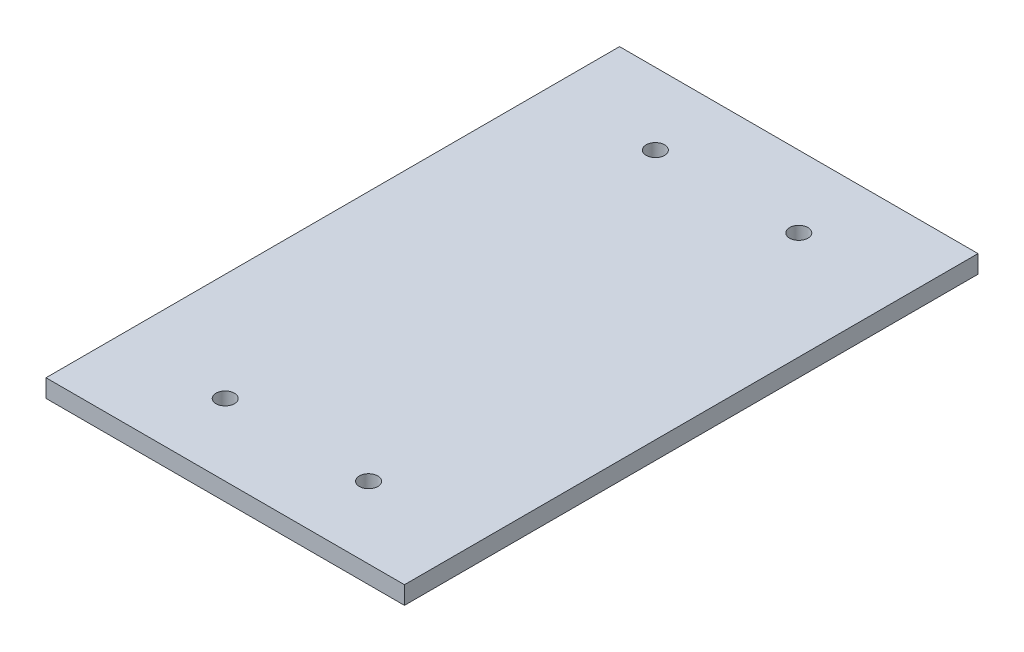
ISO-10303-21;
HEADER;
FILE_DESCRIPTION(('STEP AP214'),'2;1');
FILE_NAME('part.step','',(''),(''),'','','');
FILE_SCHEMA(('AUTOMOTIVE_DESIGN { 1 0 10303 214 1 1 1 1 }'));
ENDSEC;
DATA;
#1=APPLICATION_CONTEXT('core data for automotive mechanical design processes');
#2=APPLICATION_PROTOCOL_DEFINITION('international standard','automotive_design',2000,#1);
#3=PRODUCT_CONTEXT('',#1,'mechanical');
#4=PRODUCT('Part','Part','',(#3));
#5=PRODUCT_RELATED_PRODUCT_CATEGORY('part','',(#4));
#6=PRODUCT_DEFINITION_FORMATION('','',#4);
#7=PRODUCT_DEFINITION_CONTEXT('part definition',#1,'design');
#8=PRODUCT_DEFINITION('design','',#6,#7);
#9=PRODUCT_DEFINITION_SHAPE('','',#8);
#10=(LENGTH_UNIT() NAMED_UNIT(*) SI_UNIT(.MILLI.,.METRE.));
#11=(NAMED_UNIT(*) PLANE_ANGLE_UNIT() SI_UNIT($,.RADIAN.));
#12=(NAMED_UNIT(*) SI_UNIT($,.STERADIAN.) SOLID_ANGLE_UNIT());
#13=UNCERTAINTY_MEASURE_WITH_UNIT(LENGTH_MEASURE(1.E-05),#10,'distance_accuracy_value','');
#14=(GEOMETRIC_REPRESENTATION_CONTEXT(3) GLOBAL_UNCERTAINTY_ASSIGNED_CONTEXT((#13)) GLOBAL_UNIT_ASSIGNED_CONTEXT((#10,
#11,#12)) REPRESENTATION_CONTEXT('',''));
#15=CARTESIAN_POINT('',(0.,0.,0.));
#16=DIRECTION('',(0.,0.,1.));
#17=DIRECTION('',(1.,0.,0.));
#18=AXIS2_PLACEMENT_3D('',#15,#16,#17);
#19=CARTESIAN_POINT('',(63.5,6.35,-101.6));
#20=DIRECTION('',(-1.,0.,0.));
#21=DIRECTION('',(0.,0.,1.));
#22=AXIS2_PLACEMENT_3D('',#19,#20,#21);
#23=PLANE('',#22);
#24=DIRECTION('',(0.,0.,-1.));
#25=VECTOR('',#24,1.);
#26=CARTESIAN_POINT('',(63.5,0.,-101.6));
#27=LINE('',#26,#25);
#28=CARTESIAN_POINT('',(63.5,0.,101.6));
#29=VERTEX_POINT('',#28);
#30=CARTESIAN_POINT('',(63.5,0.,-101.6));
#31=VERTEX_POINT('',#30);
#32=EDGE_CURVE('E97',#29,#31,#27,.T.);
#33=ORIENTED_EDGE('',*,*,#32,.T.);
#34=DIRECTION('',(0.,-1.,0.));
#35=VECTOR('',#34,1.);
#36=CARTESIAN_POINT('',(63.5,6.35,-101.6));
#37=LINE('',#36,#35);
#38=CARTESIAN_POINT('',(63.5,6.35,-101.6));
#39=VERTEX_POINT('',#38);
#40=EDGE_CURVE('E11',#39,#31,#37,.T.);
#41=ORIENTED_EDGE('',*,*,#40,.F.);
#42=DIRECTION('',(0.,0.,-1.));
#43=VECTOR('',#42,1.);
#44=CARTESIAN_POINT('',(63.5,6.35,-101.6));
#45=LINE('',#44,#43);
#46=CARTESIAN_POINT('',(63.5,6.35,101.6));
#47=VERTEX_POINT('',#46);
#48=EDGE_CURVE('E85',#47,#39,#45,.T.);
#49=ORIENTED_EDGE('',*,*,#48,.F.);
#50=DIRECTION('',(0.,-1.,0.));
#51=VECTOR('',#50,1.);
#52=CARTESIAN_POINT('',(63.5,6.35,101.6));
#53=LINE('',#52,#51);
#54=EDGE_CURVE('E93',#47,#29,#53,.T.);
#55=ORIENTED_EDGE('',*,*,#54,.T.);
#56=EDGE_LOOP('',(#33,#41,#49,#55));
#57=FACE_BOUND('',#56,.T.);
#58=ADVANCED_FACE('F34',(#57),#23,.F.);
#59=CARTESIAN_POINT('',(-63.5,6.35,-101.6));
#60=DIRECTION('',(0.,0.,1.));
#61=DIRECTION('',(1.,0.,0.));
#62=AXIS2_PLACEMENT_3D('',#59,#60,#61);
#63=PLANE('',#62);
#64=DIRECTION('',(-1.,0.,0.));
#65=VECTOR('',#64,1.);
#66=CARTESIAN_POINT('',(-63.5,0.,-101.6));
#67=LINE('',#66,#65);
#68=CARTESIAN_POINT('',(-63.5,0.,-101.6));
#69=VERTEX_POINT('',#68);
#70=EDGE_CURVE('E89',#31,#69,#67,.T.);
#71=ORIENTED_EDGE('',*,*,#70,.T.);
#72=DIRECTION('',(0.,-1.,0.));
#73=VECTOR('',#72,1.);
#74=CARTESIAN_POINT('',(-63.5,6.35,-101.6));
#75=LINE('',#74,#73);
#76=CARTESIAN_POINT('',(-63.5,6.35,-101.6));
#77=VERTEX_POINT('',#76);
#78=EDGE_CURVE('E42',#77,#69,#75,.T.);
#79=ORIENTED_EDGE('',*,*,#78,.F.);
#80=DIRECTION('',(-1.,0.,0.));
#81=VECTOR('',#80,1.);
#82=CARTESIAN_POINT('',(-63.5,6.35,-101.6));
#83=LINE('',#82,#81);
#84=EDGE_CURVE('E80',#39,#77,#83,.T.);
#85=ORIENTED_EDGE('',*,*,#84,.F.);
#86=ORIENTED_EDGE('',*,*,#40,.T.);
#87=EDGE_LOOP('',(#71,#79,#85,#86));
#88=FACE_BOUND('',#87,.T.);
#89=ADVANCED_FACE('F88',(#88),#63,.F.);
#90=CARTESIAN_POINT('',(-63.5,6.35,-101.6));
#91=DIRECTION('',(1.,0.,0.));
#92=DIRECTION('',(0.,0.,-1.));
#93=AXIS2_PLACEMENT_3D('',#90,#91,#92);
#94=PLANE('',#93);
#95=DIRECTION('',(0.,0.,1.));
#96=VECTOR('',#95,1.);
#97=CARTESIAN_POINT('',(-63.5,0.,-101.6));
#98=LINE('',#97,#96);
#99=CARTESIAN_POINT('',(-63.5,0.,101.6));
#100=VERTEX_POINT('',#99);
#101=EDGE_CURVE('E67',#69,#100,#98,.T.);
#102=ORIENTED_EDGE('',*,*,#101,.T.);
#103=DIRECTION('',(0.,-1.,0.));
#104=VECTOR('',#103,1.);
#105=CARTESIAN_POINT('',(-63.5,6.35,101.6));
#106=LINE('',#105,#104);
#107=CARTESIAN_POINT('',(-63.5,6.35,101.6));
#108=VERTEX_POINT('',#107);
#109=EDGE_CURVE('E90',#108,#100,#106,.T.);
#110=ORIENTED_EDGE('',*,*,#109,.F.);
#111=DIRECTION('',(0.,0.,1.));
#112=VECTOR('',#111,1.);
#113=CARTESIAN_POINT('',(-63.5,6.35,-101.6));
#114=LINE('',#113,#112);
#115=EDGE_CURVE('E83',#77,#108,#114,.T.);
#116=ORIENTED_EDGE('',*,*,#115,.F.);
#117=ORIENTED_EDGE('',*,*,#78,.T.);
#118=EDGE_LOOP('',(#102,#110,#116,#117));
#119=FACE_BOUND('',#118,.T.);
#120=ADVANCED_FACE('F91',(#119),#94,.F.);
#121=CARTESIAN_POINT('',(-63.5,6.35,101.6));
#122=DIRECTION('',(0.,0.,-1.));
#123=DIRECTION('',(-1.,0.,0.));
#124=AXIS2_PLACEMENT_3D('',#121,#122,#123);
#125=PLANE('',#124);
#126=DIRECTION('',(1.,0.,0.));
#127=VECTOR('',#126,1.);
#128=CARTESIAN_POINT('',(-63.5,0.,101.6));
#129=LINE('',#128,#127);
#130=EDGE_CURVE('E73',#100,#29,#129,.T.);
#131=ORIENTED_EDGE('',*,*,#130,.T.);
#132=ORIENTED_EDGE('',*,*,#54,.F.);
#133=DIRECTION('',(1.,0.,0.));
#134=VECTOR('',#133,1.);
#135=CARTESIAN_POINT('',(-63.5,6.35,101.6));
#136=LINE('',#135,#134);
#137=EDGE_CURVE('E50',#108,#47,#136,.T.);
#138=ORIENTED_EDGE('',*,*,#137,.F.);
#139=ORIENTED_EDGE('',*,*,#109,.T.);
#140=EDGE_LOOP('',(#131,#132,#138,#139));
#141=FACE_BOUND('',#140,.T.);
#142=ADVANCED_FACE('F105',(#141),#125,.F.);
#143=CARTESIAN_POINT('',(0.,6.35,0.));
#144=DIRECTION('',(0.,1.,0.));
#145=DIRECTION('',(0.,0.,1.));
#146=AXIS2_PLACEMENT_3D('',#143,#144,#145);
#147=PLANE('',#146);
#148=CARTESIAN_POINT('',(-25.4,6.35,-76.2));
#149=DIRECTION('',(0.,1.,0.));
#150=DIRECTION('',(0.,0.,1.));
#151=AXIS2_PLACEMENT_3D('',#148,#149,#150);
#152=CIRCLE('',#151,3.2639);
#153=CARTESIAN_POINT('',(-25.4,6.35,-72.9361));
#154=VERTEX_POINT('',#153);
#155=EDGE_CURVE('E131',#154,#154,#152,.T.);
#156=ORIENTED_EDGE('',*,*,#155,.F.);
#157=EDGE_LOOP('',(#156));
#158=FACE_BOUND('',#157,.T.);
#159=CARTESIAN_POINT('',(25.4,6.35,-76.2));
#160=DIRECTION('',(0.,1.,0.));
#161=DIRECTION('',(0.,0.,1.));
#162=AXIS2_PLACEMENT_3D('',#159,#160,#161);
#163=CIRCLE('',#162,3.2639);
#164=CARTESIAN_POINT('',(25.4,6.35,-72.9361));
#165=VERTEX_POINT('',#164);
#166=EDGE_CURVE('E125',#165,#165,#163,.T.);
#167=ORIENTED_EDGE('',*,*,#166,.F.);
#168=EDGE_LOOP('',(#167));
#169=FACE_BOUND('',#168,.T.);
#170=CARTESIAN_POINT('',(25.4,6.35,76.2));
#171=DIRECTION('',(0.,1.,0.));
#172=DIRECTION('',(0.,0.,1.));
#173=AXIS2_PLACEMENT_3D('',#170,#171,#172);
#174=CIRCLE('',#173,3.2639);
#175=CARTESIAN_POINT('',(25.4,6.35,79.4639));
#176=VERTEX_POINT('',#175);
#177=EDGE_CURVE('E119',#176,#176,#174,.T.);
#178=ORIENTED_EDGE('',*,*,#177,.F.);
#179=EDGE_LOOP('',(#178));
#180=FACE_BOUND('',#179,.T.);
#181=CARTESIAN_POINT('',(-25.4,6.35,76.2));
#182=DIRECTION('',(0.,1.,0.));
#183=DIRECTION('',(0.,0.,1.));
#184=AXIS2_PLACEMENT_3D('',#181,#182,#183);
#185=CIRCLE('',#184,3.2639);
#186=CARTESIAN_POINT('',(-25.4,6.35,79.4639));
#187=VERTEX_POINT('',#186);
#188=EDGE_CURVE('E113',#187,#187,#185,.T.);
#189=ORIENTED_EDGE('',*,*,#188,.F.);
#190=EDGE_LOOP('',(#189));
#191=FACE_BOUND('',#190,.T.);
#192=ORIENTED_EDGE('',*,*,#48,.T.);
#193=ORIENTED_EDGE('',*,*,#84,.T.);
#194=ORIENTED_EDGE('',*,*,#115,.T.);
#195=ORIENTED_EDGE('',*,*,#137,.T.);
#196=EDGE_LOOP('',(#192,#193,#194,#195));
#197=FACE_BOUND('',#196,.T.);
#198=ADVANCED_FACE('F81',(#158,#169,#180,#191,#197),#147,.T.);
#199=CARTESIAN_POINT('',(0.,0.,0.));
#200=DIRECTION('',(0.,1.,0.));
#201=DIRECTION('',(0.,0.,1.));
#202=AXIS2_PLACEMENT_3D('',#199,#200,#201);
#203=PLANE('',#202);
#204=CARTESIAN_POINT('',(-25.4,0.,-76.2));
#205=DIRECTION('',(0.,1.,0.));
#206=DIRECTION('',(0.,0.,1.));
#207=AXIS2_PLACEMENT_3D('',#204,#205,#206);
#208=CIRCLE('',#207,3.2639);
#209=CARTESIAN_POINT('',(-25.4,0.,-72.9361));
#210=VERTEX_POINT('',#209);
#211=EDGE_CURVE('E128',#210,#210,#208,.T.);
#212=ORIENTED_EDGE('',*,*,#211,.T.);
#213=EDGE_LOOP('',(#212));
#214=FACE_BOUND('',#213,.T.);
#215=CARTESIAN_POINT('',(25.4,0.,-76.2));
#216=DIRECTION('',(0.,1.,0.));
#217=DIRECTION('',(0.,0.,1.));
#218=AXIS2_PLACEMENT_3D('',#215,#216,#217);
#219=CIRCLE('',#218,3.2639);
#220=CARTESIAN_POINT('',(25.4,0.,-72.9361));
#221=VERTEX_POINT('',#220);
#222=EDGE_CURVE('E122',#221,#221,#219,.T.);
#223=ORIENTED_EDGE('',*,*,#222,.T.);
#224=EDGE_LOOP('',(#223));
#225=FACE_BOUND('',#224,.T.);
#226=CARTESIAN_POINT('',(25.4,0.,76.2));
#227=DIRECTION('',(0.,1.,0.));
#228=DIRECTION('',(0.,0.,1.));
#229=AXIS2_PLACEMENT_3D('',#226,#227,#228);
#230=CIRCLE('',#229,3.2639);
#231=CARTESIAN_POINT('',(25.4,0.,79.4639));
#232=VERTEX_POINT('',#231);
#233=EDGE_CURVE('E116',#232,#232,#230,.T.);
#234=ORIENTED_EDGE('',*,*,#233,.T.);
#235=EDGE_LOOP('',(#234));
#236=FACE_BOUND('',#235,.T.);
#237=CARTESIAN_POINT('',(-25.4,0.,76.2));
#238=DIRECTION('',(0.,1.,0.));
#239=DIRECTION('',(0.,0.,1.));
#240=AXIS2_PLACEMENT_3D('',#237,#238,#239);
#241=CIRCLE('',#240,3.2639);
#242=CARTESIAN_POINT('',(-25.4,0.,79.4639));
#243=VERTEX_POINT('',#242);
#244=EDGE_CURVE('E100',#243,#243,#241,.T.);
#245=ORIENTED_EDGE('',*,*,#244,.T.);
#246=EDGE_LOOP('',(#245));
#247=FACE_BOUND('',#246,.T.);
#248=ORIENTED_EDGE('',*,*,#32,.F.);
#249=ORIENTED_EDGE('',*,*,#130,.F.);
#250=ORIENTED_EDGE('',*,*,#101,.F.);
#251=ORIENTED_EDGE('',*,*,#70,.F.);
#252=EDGE_LOOP('',(#248,#249,#250,#251));
#253=FACE_BOUND('',#252,.T.);
#254=ADVANCED_FACE('F108',(#214,#225,#236,#247,#253),#203,.F.);
#255=CARTESIAN_POINT('',(-25.4,6.35,76.2));
#256=DIRECTION('',(0.,1.,0.));
#257=DIRECTION('',(0.,0.,1.));
#258=AXIS2_PLACEMENT_3D('',#255,#256,#257);
#259=CYLINDRICAL_SURFACE('',#258,3.2639);
#260=ORIENTED_EDGE('',*,*,#244,.F.);
#261=EDGE_LOOP('',(#260));
#262=FACE_BOUND('',#261,.T.);
#263=ORIENTED_EDGE('',*,*,#188,.T.);
#264=EDGE_LOOP('',(#263));
#265=FACE_BOUND('',#264,.T.);
#266=ADVANCED_FACE('F146',(#262,#265),#259,.F.);
#267=CARTESIAN_POINT('',(25.4,6.35,76.2));
#268=DIRECTION('',(0.,1.,0.));
#269=DIRECTION('',(0.,0.,1.));
#270=AXIS2_PLACEMENT_3D('',#267,#268,#269);
#271=CYLINDRICAL_SURFACE('',#270,3.2639);
#272=ORIENTED_EDGE('',*,*,#233,.F.);
#273=EDGE_LOOP('',(#272));
#274=FACE_BOUND('',#273,.T.);
#275=ORIENTED_EDGE('',*,*,#177,.T.);
#276=EDGE_LOOP('',(#275));
#277=FACE_BOUND('',#276,.T.);
#278=ADVANCED_FACE('F148',(#274,#277),#271,.F.);
#279=CARTESIAN_POINT('',(25.4,6.35,-76.2));
#280=DIRECTION('',(0.,1.,0.));
#281=DIRECTION('',(0.,0.,1.));
#282=AXIS2_PLACEMENT_3D('',#279,#280,#281);
#283=CYLINDRICAL_SURFACE('',#282,3.2639);
#284=ORIENTED_EDGE('',*,*,#222,.F.);
#285=EDGE_LOOP('',(#284));
#286=FACE_BOUND('',#285,.T.);
#287=ORIENTED_EDGE('',*,*,#166,.T.);
#288=EDGE_LOOP('',(#287));
#289=FACE_BOUND('',#288,.T.);
#290=ADVANCED_FACE('F155',(#286,#289),#283,.F.);
#291=CARTESIAN_POINT('',(-25.4,6.35,-76.2));
#292=DIRECTION('',(0.,1.,0.));
#293=DIRECTION('',(0.,0.,1.));
#294=AXIS2_PLACEMENT_3D('',#291,#292,#293);
#295=CYLINDRICAL_SURFACE('',#294,3.2639);
#296=ORIENTED_EDGE('',*,*,#211,.F.);
#297=EDGE_LOOP('',(#296));
#298=FACE_BOUND('',#297,.T.);
#299=ORIENTED_EDGE('',*,*,#155,.T.);
#300=EDGE_LOOP('',(#299));
#301=FACE_BOUND('',#300,.T.);
#302=ADVANCED_FACE('F135',(#298,#301),#295,.F.);
#303=CLOSED_SHELL('',(#58,#89,#120,#142,#198,#254,#266,#278,#290,#302));
#304=MANIFOLD_SOLID_BREP('B2',#303);
#305=ADVANCED_BREP_SHAPE_REPRESENTATION('',(#18,#304),#14);
#306=SHAPE_DEFINITION_REPRESENTATION(#9,#305);
ENDSEC;
END-ISO-10303-21;
